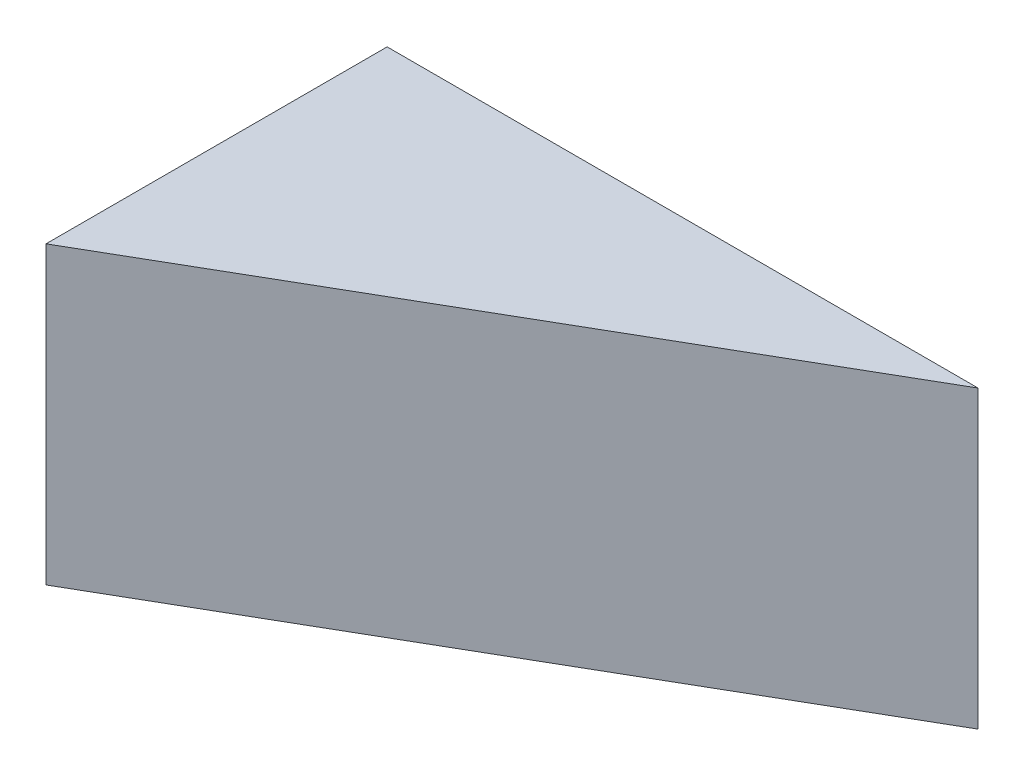
ISO-10303-21;
HEADER;
FILE_DESCRIPTION(('STEP AP214'),'2;1');
FILE_NAME('part.step','',(''),(''),'','','');
FILE_SCHEMA(('AUTOMOTIVE_DESIGN { 1 0 10303 214 1 1 1 1 }'));
ENDSEC;
DATA;
#1=APPLICATION_CONTEXT('core data for automotive mechanical design processes');
#2=APPLICATION_PROTOCOL_DEFINITION('international standard','automotive_design',2000,#1);
#3=PRODUCT_CONTEXT('',#1,'mechanical');
#4=PRODUCT('Part','Part','',(#3));
#5=PRODUCT_RELATED_PRODUCT_CATEGORY('part','',(#4));
#6=PRODUCT_DEFINITION_FORMATION('','',#4);
#7=PRODUCT_DEFINITION_CONTEXT('part definition',#1,'design');
#8=PRODUCT_DEFINITION('design','',#6,#7);
#9=PRODUCT_DEFINITION_SHAPE('','',#8);
#10=(LENGTH_UNIT() NAMED_UNIT(*) SI_UNIT(.MILLI.,.METRE.));
#11=(NAMED_UNIT(*) PLANE_ANGLE_UNIT() SI_UNIT($,.RADIAN.));
#12=(NAMED_UNIT(*) SI_UNIT($,.STERADIAN.) SOLID_ANGLE_UNIT());
#13=UNCERTAINTY_MEASURE_WITH_UNIT(LENGTH_MEASURE(1.E-05),#10,'distance_accuracy_value','');
#14=(GEOMETRIC_REPRESENTATION_CONTEXT(3) GLOBAL_UNCERTAINTY_ASSIGNED_CONTEXT((#13)) GLOBAL_UNIT_ASSIGNED_CONTEXT((#10,
#11,#12)) REPRESENTATION_CONTEXT('',''));
#15=CARTESIAN_POINT('',(0.,0.,0.));
#16=DIRECTION('',(0.,0.,1.));
#17=DIRECTION('',(1.,0.,0.));
#18=AXIS2_PLACEMENT_3D('',#15,#16,#17);
#19=CARTESIAN_POINT('',(0.,20.,23.0940107675847));
#20=DIRECTION('',(1.,0.,0.));
#21=DIRECTION('',(0.,0.,-1.));
#22=AXIS2_PLACEMENT_3D('',#19,#20,#21);
#23=PLANE('',#22);
#24=DIRECTION('',(0.,0.,1.));
#25=VECTOR('',#24,1.);
#26=CARTESIAN_POINT('',(0.,0.,23.0940107675847));
#27=LINE('',#26,#25);
#28=CARTESIAN_POINT('',(0.,0.,0.));
#29=VERTEX_POINT('',#28);
#30=CARTESIAN_POINT('',(0.,0.,23.0940107675847));
#31=VERTEX_POINT('',#30);
#32=EDGE_CURVE('E89',#29,#31,#27,.T.);
#33=ORIENTED_EDGE('',*,*,#32,.T.);
#34=DIRECTION('',(0.,-1.,0.));
#35=VECTOR('',#34,1.);
#36=CARTESIAN_POINT('',(0.,20.,23.0940107675847));
#37=LINE('',#36,#35);
#38=CARTESIAN_POINT('',(0.,20.,23.0940107675847));
#39=VERTEX_POINT('',#38);
#40=EDGE_CURVE('E11',#39,#31,#37,.T.);
#41=ORIENTED_EDGE('',*,*,#40,.F.);
#42=DIRECTION('',(0.,0.,1.));
#43=VECTOR('',#42,1.);
#44=CARTESIAN_POINT('',(0.,20.,23.0940107675847));
#45=LINE('',#44,#43);
#46=CARTESIAN_POINT('',(0.,20.,0.));
#47=VERTEX_POINT('',#46);
#48=EDGE_CURVE('E81',#47,#39,#45,.T.);
#49=ORIENTED_EDGE('',*,*,#48,.F.);
#50=DIRECTION('',(0.,-1.,0.));
#51=VECTOR('',#50,1.);
#52=CARTESIAN_POINT('',(0.,20.,0.));
#53=LINE('',#52,#51);
#54=EDGE_CURVE('E90',#47,#29,#53,.T.);
#55=ORIENTED_EDGE('',*,*,#54,.T.);
#56=EDGE_LOOP('',(#33,#41,#49,#55));
#57=FACE_BOUND('',#56,.T.);
#58=ADVANCED_FACE('F39',(#57),#23,.F.);
#59=CARTESIAN_POINT('',(40.,20.,0.));
#60=DIRECTION('',(-0.499999999999995,0.,-0.866025403784442));
#61=DIRECTION('',(-0.866025403784442,0.,0.499999999999995));
#62=AXIS2_PLACEMENT_3D('',#59,#60,#61);
#63=PLANE('',#62);
#64=DIRECTION('',(0.866025403784442,0.,-0.499999999999995));
#65=VECTOR('',#64,1.);
#66=CARTESIAN_POINT('',(40.,0.,0.));
#67=LINE('',#66,#65);
#68=CARTESIAN_POINT('',(40.,0.,0.));
#69=VERTEX_POINT('',#68);
#70=EDGE_CURVE('E68',#31,#69,#67,.T.);
#71=ORIENTED_EDGE('',*,*,#70,.T.);
#72=DIRECTION('',(0.,-1.,0.));
#73=VECTOR('',#72,1.);
#74=CARTESIAN_POINT('',(40.,20.,0.));
#75=LINE('',#74,#73);
#76=CARTESIAN_POINT('',(40.,20.,0.));
#77=VERTEX_POINT('',#76);
#78=EDGE_CURVE('E48',#77,#69,#75,.T.);
#79=ORIENTED_EDGE('',*,*,#78,.F.);
#80=DIRECTION('',(0.866025403784442,0.,-0.499999999999995));
#81=VECTOR('',#80,1.);
#82=CARTESIAN_POINT('',(40.,20.,0.));
#83=LINE('',#82,#81);
#84=EDGE_CURVE('E76',#39,#77,#83,.T.);
#85=ORIENTED_EDGE('',*,*,#84,.F.);
#86=ORIENTED_EDGE('',*,*,#40,.T.);
#87=EDGE_LOOP('',(#71,#79,#85,#86));
#88=FACE_BOUND('',#87,.T.);
#89=ADVANCED_FACE('F77',(#88),#63,.F.);
#90=CARTESIAN_POINT('',(0.,20.,0.));
#91=DIRECTION('',(0.,0.,1.));
#92=DIRECTION('',(1.,0.,0.));
#93=AXIS2_PLACEMENT_3D('',#90,#91,#92);
#94=PLANE('',#93);
#95=DIRECTION('',(-1.,0.,0.));
#96=VECTOR('',#95,1.);
#97=CARTESIAN_POINT('',(0.,0.,0.));
#98=LINE('',#97,#96);
#99=EDGE_CURVE('E73',#69,#29,#98,.T.);
#100=ORIENTED_EDGE('',*,*,#99,.T.);
#101=ORIENTED_EDGE('',*,*,#54,.F.);
#102=DIRECTION('',(-1.,0.,0.));
#103=VECTOR('',#102,1.);
#104=CARTESIAN_POINT('',(0.,20.,0.));
#105=LINE('',#104,#103);
#106=EDGE_CURVE('E56',#77,#47,#105,.T.);
#107=ORIENTED_EDGE('',*,*,#106,.F.);
#108=ORIENTED_EDGE('',*,*,#78,.T.);
#109=EDGE_LOOP('',(#100,#101,#107,#108));
#110=FACE_BOUND('',#109,.T.);
#111=ADVANCED_FACE('F102',(#110),#94,.F.);
#112=CARTESIAN_POINT('',(0.,20.,0.));
#113=DIRECTION('',(0.,-1.,0.));
#114=DIRECTION('',(0.,0.,-1.));
#115=AXIS2_PLACEMENT_3D('',#112,#113,#114);
#116=PLANE('',#115);
#117=ORIENTED_EDGE('',*,*,#48,.T.);
#118=ORIENTED_EDGE('',*,*,#84,.T.);
#119=ORIENTED_EDGE('',*,*,#106,.T.);
#120=EDGE_LOOP('',(#117,#118,#119));
#121=FACE_BOUND('',#120,.T.);
#122=ADVANCED_FACE('F84',(#121),#116,.F.);
#123=CARTESIAN_POINT('',(0.,0.,0.));
#124=DIRECTION('',(0.,-1.,0.));
#125=DIRECTION('',(0.,0.,-1.));
#126=AXIS2_PLACEMENT_3D('',#123,#124,#125);
#127=PLANE('',#126);
#128=ORIENTED_EDGE('',*,*,#32,.F.);
#129=ORIENTED_EDGE('',*,*,#99,.F.);
#130=ORIENTED_EDGE('',*,*,#70,.F.);
#131=EDGE_LOOP('',(#128,#129,#130));
#132=FACE_BOUND('',#131,.T.);
#133=ADVANCED_FACE('F103',(#132),#127,.T.);
#134=CLOSED_SHELL('',(#58,#89,#111,#122,#133));
#135=MANIFOLD_SOLID_BREP('B2',#134);
#136=ADVANCED_BREP_SHAPE_REPRESENTATION('',(#18,#135),#14);
#137=SHAPE_DEFINITION_REPRESENTATION(#9,#136);
ENDSEC;
END-ISO-10303-21;
